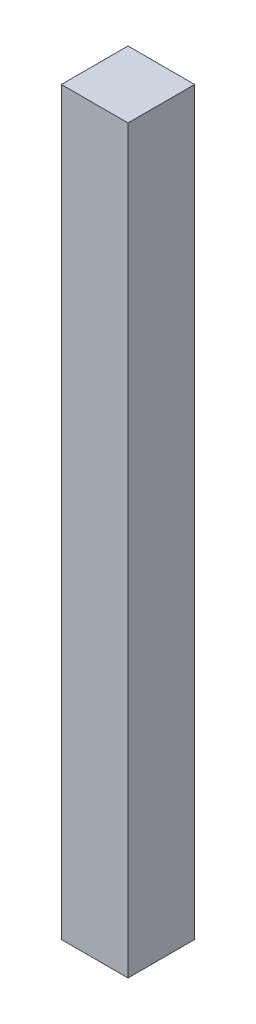
ISO-10303-21;
HEADER;
FILE_DESCRIPTION(('STEP AP214'),'2;1');
FILE_NAME('part.step','',(''),(''),'','','');
FILE_SCHEMA(('AUTOMOTIVE_DESIGN { 1 0 10303 214 1 1 1 1 }'));
ENDSEC;
DATA;
#1=APPLICATION_CONTEXT('core data for automotive mechanical design processes');
#2=APPLICATION_PROTOCOL_DEFINITION('international standard','automotive_design',2000,#1);
#3=PRODUCT_CONTEXT('',#1,'mechanical');
#4=PRODUCT('Part','Part','',(#3));
#5=PRODUCT_RELATED_PRODUCT_CATEGORY('part','',(#4));
#6=PRODUCT_DEFINITION_FORMATION('','',#4);
#7=PRODUCT_DEFINITION_CONTEXT('part definition',#1,'design');
#8=PRODUCT_DEFINITION('design','',#6,#7);
#9=PRODUCT_DEFINITION_SHAPE('','',#8);
#10=(LENGTH_UNIT() NAMED_UNIT(*) SI_UNIT(.MILLI.,.METRE.));
#11=(NAMED_UNIT(*) PLANE_ANGLE_UNIT() SI_UNIT($,.RADIAN.));
#12=(NAMED_UNIT(*) SI_UNIT($,.STERADIAN.) SOLID_ANGLE_UNIT());
#13=UNCERTAINTY_MEASURE_WITH_UNIT(LENGTH_MEASURE(1.E-05),#10,'distance_accuracy_value','');
#14=(GEOMETRIC_REPRESENTATION_CONTEXT(3) GLOBAL_UNCERTAINTY_ASSIGNED_CONTEXT((#13)) GLOBAL_UNIT_ASSIGNED_CONTEXT((#10,
#11,#12)) REPRESENTATION_CONTEXT('',''));
#15=CARTESIAN_POINT('',(0.,0.,0.));
#16=DIRECTION('',(0.,0.,1.));
#17=DIRECTION('',(1.,0.,0.));
#18=AXIS2_PLACEMENT_3D('',#15,#16,#17);
#19=CARTESIAN_POINT('',(84.,436.,-30.));
#20=DIRECTION('',(-1.,0.,0.));
#21=DIRECTION('',(0.,0.,1.));
#22=AXIS2_PLACEMENT_3D('',#19,#20,#21);
#23=PLANE('',#22);
#24=DIRECTION('',(0.,-1.,0.));
#25=VECTOR('',#24,1.);
#26=CARTESIAN_POINT('',(84.,436.,-12.));
#27=LINE('',#26,#25);
#28=CARTESIAN_POINT('',(84.,636.,-12.));
#29=VERTEX_POINT('',#28);
#30=CARTESIAN_POINT('',(84.,436.,-12.));
#31=VERTEX_POINT('',#30);
#32=EDGE_CURVE('E103',#29,#31,#27,.T.);
#33=ORIENTED_EDGE('',*,*,#32,.F.);
#34=DIRECTION('',(0.,0.,1.));
#35=VECTOR('',#34,1.);
#36=CARTESIAN_POINT('',(84.,636.,-30.));
#37=LINE('',#36,#35);
#38=CARTESIAN_POINT('',(84.,636.,-30.));
#39=VERTEX_POINT('',#38);
#40=EDGE_CURVE('E11',#39,#29,#37,.T.);
#41=ORIENTED_EDGE('',*,*,#40,.F.);
#42=DIRECTION('',(0.,-1.,0.));
#43=VECTOR('',#42,1.);
#44=CARTESIAN_POINT('',(84.,436.,-30.));
#45=LINE('',#44,#43);
#46=CARTESIAN_POINT('',(84.,436.,-30.));
#47=VERTEX_POINT('',#46);
#48=EDGE_CURVE('E97',#39,#47,#45,.T.);
#49=ORIENTED_EDGE('',*,*,#48,.T.);
#50=DIRECTION('',(0.,0.,1.));
#51=VECTOR('',#50,1.);
#52=CARTESIAN_POINT('',(84.,436.,-30.));
#53=LINE('',#52,#51);
#54=EDGE_CURVE('E42',#47,#31,#53,.T.);
#55=ORIENTED_EDGE('',*,*,#54,.T.);
#56=EDGE_LOOP('',(#33,#41,#49,#55));
#57=FACE_BOUND('',#56,.T.);
#58=ADVANCED_FACE('F39',(#57),#23,.T.);
#59=CARTESIAN_POINT('',(84.,636.,-30.));
#60=DIRECTION('',(0.,1.,0.));
#61=DIRECTION('',(0.,0.,1.));
#62=AXIS2_PLACEMENT_3D('',#59,#60,#61);
#63=PLANE('',#62);
#64=DIRECTION('',(-1.,0.,0.));
#65=VECTOR('',#64,1.);
#66=CARTESIAN_POINT('',(84.,636.,-12.));
#67=LINE('',#66,#65);
#68=CARTESIAN_POINT('',(102.,636.,-12.));
#69=VERTEX_POINT('',#68);
#70=EDGE_CURVE('E99',#69,#29,#67,.T.);
#71=ORIENTED_EDGE('',*,*,#70,.F.);
#72=DIRECTION('',(0.,0.,1.));
#73=VECTOR('',#72,1.);
#74=CARTESIAN_POINT('',(102.,636.,-30.));
#75=LINE('',#74,#73);
#76=CARTESIAN_POINT('',(102.,636.,-30.));
#77=VERTEX_POINT('',#76);
#78=EDGE_CURVE('E48',#77,#69,#75,.T.);
#79=ORIENTED_EDGE('',*,*,#78,.F.);
#80=DIRECTION('',(-1.,0.,0.));
#81=VECTOR('',#80,1.);
#82=CARTESIAN_POINT('',(84.,636.,-30.));
#83=LINE('',#82,#81);
#84=EDGE_CURVE('E94',#77,#39,#83,.T.);
#85=ORIENTED_EDGE('',*,*,#84,.T.);
#86=ORIENTED_EDGE('',*,*,#40,.T.);
#87=EDGE_LOOP('',(#71,#79,#85,#86));
#88=FACE_BOUND('',#87,.T.);
#89=ADVANCED_FACE('F113',(#88),#63,.T.);
#90=CARTESIAN_POINT('',(102.,436.,-30.));
#91=DIRECTION('',(1.,0.,0.));
#92=DIRECTION('',(0.,0.,-1.));
#93=AXIS2_PLACEMENT_3D('',#90,#91,#92);
#94=PLANE('',#93);
#95=DIRECTION('',(0.,1.,0.));
#96=VECTOR('',#95,1.);
#97=CARTESIAN_POINT('',(102.,436.,-12.));
#98=LINE('',#97,#96);
#99=CARTESIAN_POINT('',(102.,436.,-12.));
#100=VERTEX_POINT('',#99);
#101=EDGE_CURVE('E89',#100,#69,#98,.T.);
#102=ORIENTED_EDGE('',*,*,#101,.F.);
#103=DIRECTION('',(0.,0.,1.));
#104=VECTOR('',#103,1.);
#105=CARTESIAN_POINT('',(102.,436.,-30.));
#106=LINE('',#105,#104);
#107=CARTESIAN_POINT('',(102.,436.,-30.));
#108=VERTEX_POINT('',#107);
#109=EDGE_CURVE('E84',#108,#100,#106,.T.);
#110=ORIENTED_EDGE('',*,*,#109,.F.);
#111=DIRECTION('',(0.,1.,0.));
#112=VECTOR('',#111,1.);
#113=CARTESIAN_POINT('',(102.,436.,-30.));
#114=LINE('',#113,#112);
#115=EDGE_CURVE('E87',#108,#77,#114,.T.);
#116=ORIENTED_EDGE('',*,*,#115,.T.);
#117=ORIENTED_EDGE('',*,*,#78,.T.);
#118=EDGE_LOOP('',(#102,#110,#116,#117));
#119=FACE_BOUND('',#118,.T.);
#120=ADVANCED_FACE('F86',(#119),#94,.T.);
#121=CARTESIAN_POINT('',(84.,436.,-30.));
#122=DIRECTION('',(0.,-1.,0.));
#123=DIRECTION('',(0.,0.,-1.));
#124=AXIS2_PLACEMENT_3D('',#121,#122,#123);
#125=PLANE('',#124);
#126=DIRECTION('',(1.,0.,0.));
#127=VECTOR('',#126,1.);
#128=CARTESIAN_POINT('',(84.,436.,-12.));
#129=LINE('',#128,#127);
#130=EDGE_CURVE('E106',#31,#100,#129,.T.);
#131=ORIENTED_EDGE('',*,*,#130,.F.);
#132=ORIENTED_EDGE('',*,*,#54,.F.);
#133=DIRECTION('',(1.,0.,0.));
#134=VECTOR('',#133,1.);
#135=CARTESIAN_POINT('',(84.,436.,-30.));
#136=LINE('',#135,#134);
#137=EDGE_CURVE('E93',#47,#108,#136,.T.);
#138=ORIENTED_EDGE('',*,*,#137,.T.);
#139=ORIENTED_EDGE('',*,*,#109,.T.);
#140=EDGE_LOOP('',(#131,#132,#138,#139));
#141=FACE_BOUND('',#140,.T.);
#142=ADVANCED_FACE('F96',(#141),#125,.T.);
#143=CARTESIAN_POINT('',(0.,0.,-30.));
#144=DIRECTION('',(0.,0.,-1.));
#145=DIRECTION('',(-1.,0.,0.));
#146=AXIS2_PLACEMENT_3D('',#143,#144,#145);
#147=PLANE('',#146);
#148=ORIENTED_EDGE('',*,*,#48,.F.);
#149=ORIENTED_EDGE('',*,*,#84,.F.);
#150=ORIENTED_EDGE('',*,*,#115,.F.);
#151=ORIENTED_EDGE('',*,*,#137,.F.);
#152=EDGE_LOOP('',(#148,#149,#150,#151));
#153=FACE_BOUND('',#152,.T.);
#154=ADVANCED_FACE('F92',(#153),#147,.T.);
#155=CARTESIAN_POINT('',(0.,0.,-12.));
#156=DIRECTION('',(0.,0.,-1.));
#157=DIRECTION('',(-1.,0.,0.));
#158=AXIS2_PLACEMENT_3D('',#155,#156,#157);
#159=PLANE('',#158);
#160=ORIENTED_EDGE('',*,*,#32,.T.);
#161=ORIENTED_EDGE('',*,*,#130,.T.);
#162=ORIENTED_EDGE('',*,*,#101,.T.);
#163=ORIENTED_EDGE('',*,*,#70,.T.);
#164=EDGE_LOOP('',(#160,#161,#162,#163));
#165=FACE_BOUND('',#164,.T.);
#166=ADVANCED_FACE('F112',(#165),#159,.F.);
#167=CLOSED_SHELL('',(#58,#89,#120,#142,#154,#166));
#168=MANIFOLD_SOLID_BREP('B2',#167);
#169=ADVANCED_BREP_SHAPE_REPRESENTATION('',(#18,#168),#14);
#170=SHAPE_DEFINITION_REPRESENTATION(#9,#169);
ENDSEC;
END-ISO-10303-21;
